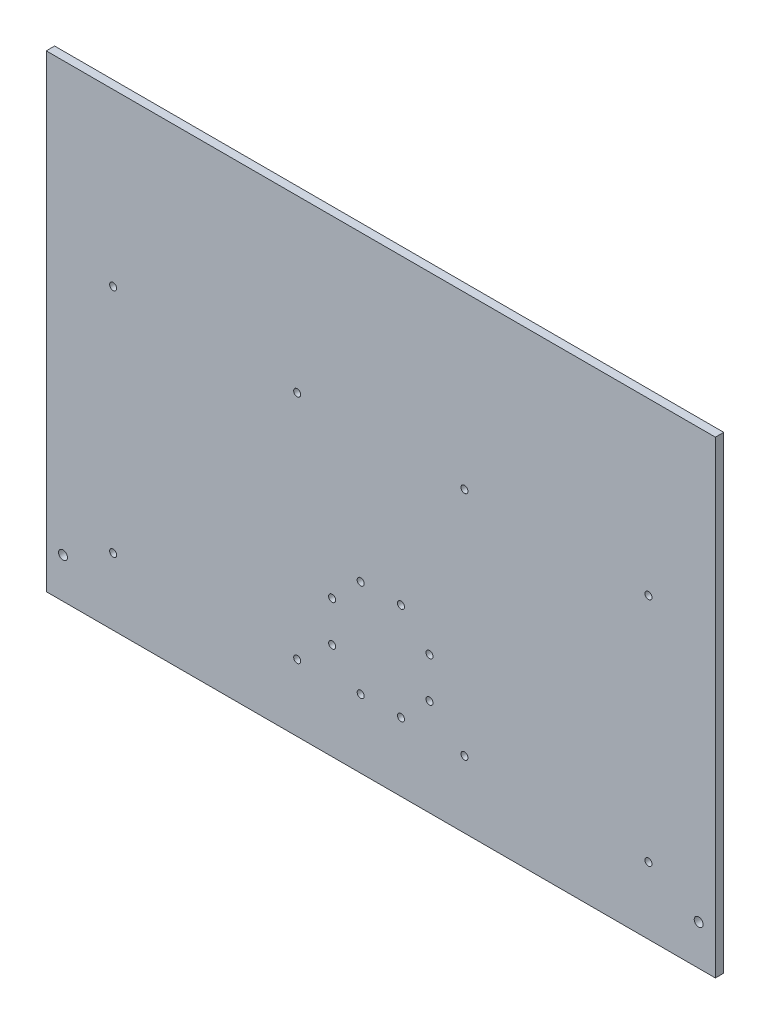
ISO-10303-21;
HEADER;
FILE_DESCRIPTION(('STEP AP214'),'2;1');
FILE_NAME('part.step','',(''),(''),'','','');
FILE_SCHEMA(('AUTOMOTIVE_DESIGN { 1 0 10303 214 1 1 1 1 }'));
ENDSEC;
DATA;
#1=APPLICATION_CONTEXT('core data for automotive mechanical design processes');
#2=APPLICATION_PROTOCOL_DEFINITION('international standard','automotive_design',2000,#1);
#3=PRODUCT_CONTEXT('',#1,'mechanical');
#4=PRODUCT('Part','Part','',(#3));
#5=PRODUCT_RELATED_PRODUCT_CATEGORY('part','',(#4));
#6=PRODUCT_DEFINITION_FORMATION('','',#4);
#7=PRODUCT_DEFINITION_CONTEXT('part definition',#1,'design');
#8=PRODUCT_DEFINITION('design','',#6,#7);
#9=PRODUCT_DEFINITION_SHAPE('','',#8);
#10=(LENGTH_UNIT() NAMED_UNIT(*) SI_UNIT(.MILLI.,.METRE.));
#11=(NAMED_UNIT(*) PLANE_ANGLE_UNIT() SI_UNIT($,.RADIAN.));
#12=(NAMED_UNIT(*) SI_UNIT($,.STERADIAN.) SOLID_ANGLE_UNIT());
#13=UNCERTAINTY_MEASURE_WITH_UNIT(LENGTH_MEASURE(1.E-05),#10,'distance_accuracy_value','');
#14=(GEOMETRIC_REPRESENTATION_CONTEXT(3) GLOBAL_UNCERTAINTY_ASSIGNED_CONTEXT((#13)) GLOBAL_UNIT_ASSIGNED_CONTEXT((#10,
#11,#12)) REPRESENTATION_CONTEXT('',''));
#15=CARTESIAN_POINT('',(0.,0.,0.));
#16=DIRECTION('',(0.,0.,1.));
#17=DIRECTION('',(1.,0.,0.));
#18=AXIS2_PLACEMENT_3D('',#15,#16,#17);
#19=CARTESIAN_POINT('',(200.,140.,5.));
#20=DIRECTION('',(-1.,0.,0.));
#21=DIRECTION('',(0.,-1.,0.));
#22=AXIS2_PLACEMENT_3D('',#19,#20,#21);
#23=PLANE('',#22);
#24=DIRECTION('',(0.,1.,0.));
#25=VECTOR('',#24,1.);
#26=CARTESIAN_POINT('',(200.,140.,0.));
#27=LINE('',#26,#25);
#28=CARTESIAN_POINT('',(200.,-140.,0.));
#29=VERTEX_POINT('',#28);
#30=CARTESIAN_POINT('',(200.,140.,0.));
#31=VERTEX_POINT('',#30);
#32=EDGE_CURVE('E112',#29,#31,#27,.T.);
#33=ORIENTED_EDGE('',*,*,#32,.T.);
#34=DIRECTION('',(0.,0.,-1.));
#35=VECTOR('',#34,1.);
#36=CARTESIAN_POINT('',(200.,140.,5.));
#37=LINE('',#36,#35);
#38=CARTESIAN_POINT('',(200.,140.,5.));
#39=VERTEX_POINT('',#38);
#40=EDGE_CURVE('E11',#39,#31,#37,.T.);
#41=ORIENTED_EDGE('',*,*,#40,.F.);
#42=DIRECTION('',(0.,1.,0.));
#43=VECTOR('',#42,1.);
#44=CARTESIAN_POINT('',(200.,140.,5.));
#45=LINE('',#44,#43);
#46=CARTESIAN_POINT('',(200.,-140.,5.));
#47=VERTEX_POINT('',#46);
#48=EDGE_CURVE('E94',#47,#39,#45,.T.);
#49=ORIENTED_EDGE('',*,*,#48,.F.);
#50=DIRECTION('',(0.,0.,-1.));
#51=VECTOR('',#50,1.);
#52=CARTESIAN_POINT('',(200.,-140.,5.));
#53=LINE('',#52,#51);
#54=EDGE_CURVE('E108',#47,#29,#53,.T.);
#55=ORIENTED_EDGE('',*,*,#54,.T.);
#56=EDGE_LOOP('',(#33,#41,#49,#55));
#57=FACE_BOUND('',#56,.T.);
#58=ADVANCED_FACE('F42',(#57),#23,.F.);
#59=CARTESIAN_POINT('',(-200.,140.,5.));
#60=DIRECTION('',(0.,-1.,0.));
#61=DIRECTION('',(0.,0.,-1.));
#62=AXIS2_PLACEMENT_3D('',#59,#60,#61);
#63=PLANE('',#62);
#64=DIRECTION('',(-1.,0.,0.));
#65=VECTOR('',#64,1.);
#66=CARTESIAN_POINT('',(-200.,140.,0.));
#67=LINE('',#66,#65);
#68=CARTESIAN_POINT('',(-200.,140.,0.));
#69=VERTEX_POINT('',#68);
#70=EDGE_CURVE('E99',#31,#69,#67,.T.);
#71=ORIENTED_EDGE('',*,*,#70,.T.);
#72=DIRECTION('',(0.,0.,-1.));
#73=VECTOR('',#72,1.);
#74=CARTESIAN_POINT('',(-200.,140.,5.));
#75=LINE('',#74,#73);
#76=CARTESIAN_POINT('',(-200.,140.,5.));
#77=VERTEX_POINT('',#76);
#78=EDGE_CURVE('E51',#77,#69,#75,.T.);
#79=ORIENTED_EDGE('',*,*,#78,.F.);
#80=DIRECTION('',(-1.,0.,0.));
#81=VECTOR('',#80,1.);
#82=CARTESIAN_POINT('',(-200.,140.,5.));
#83=LINE('',#82,#81);
#84=EDGE_CURVE('E89',#39,#77,#83,.T.);
#85=ORIENTED_EDGE('',*,*,#84,.F.);
#86=ORIENTED_EDGE('',*,*,#40,.T.);
#87=EDGE_LOOP('',(#71,#79,#85,#86));
#88=FACE_BOUND('',#87,.T.);
#89=ADVANCED_FACE('F98',(#88),#63,.F.);
#90=CARTESIAN_POINT('',(-200.,140.,5.));
#91=DIRECTION('',(1.,0.,0.));
#92=DIRECTION('',(0.,1.,0.));
#93=AXIS2_PLACEMENT_3D('',#90,#91,#92);
#94=PLANE('',#93);
#95=DIRECTION('',(0.,-1.,0.));
#96=VECTOR('',#95,1.);
#97=CARTESIAN_POINT('',(-200.,140.,0.));
#98=LINE('',#97,#96);
#99=CARTESIAN_POINT('',(-200.,-140.,0.));
#100=VERTEX_POINT('',#99);
#101=EDGE_CURVE('E76',#69,#100,#98,.T.);
#102=ORIENTED_EDGE('',*,*,#101,.T.);
#103=DIRECTION('',(0.,0.,-1.));
#104=VECTOR('',#103,1.);
#105=CARTESIAN_POINT('',(-200.,-140.,5.));
#106=LINE('',#105,#104);
#107=CARTESIAN_POINT('',(-200.,-140.,5.));
#108=VERTEX_POINT('',#107);
#109=EDGE_CURVE('E101',#108,#100,#106,.T.);
#110=ORIENTED_EDGE('',*,*,#109,.F.);
#111=DIRECTION('',(0.,-1.,0.));
#112=VECTOR('',#111,1.);
#113=CARTESIAN_POINT('',(-200.,140.,5.));
#114=LINE('',#113,#112);
#115=EDGE_CURVE('E92',#77,#108,#114,.T.);
#116=ORIENTED_EDGE('',*,*,#115,.F.);
#117=ORIENTED_EDGE('',*,*,#78,.T.);
#118=EDGE_LOOP('',(#102,#110,#116,#117));
#119=FACE_BOUND('',#118,.T.);
#120=ADVANCED_FACE('F102',(#119),#94,.F.);
#121=CARTESIAN_POINT('',(-200.,-140.,5.));
#122=DIRECTION('',(0.,1.,0.));
#123=DIRECTION('',(0.,0.,1.));
#124=AXIS2_PLACEMENT_3D('',#121,#122,#123);
#125=PLANE('',#124);
#126=DIRECTION('',(1.,0.,0.));
#127=VECTOR('',#126,1.);
#128=CARTESIAN_POINT('',(-200.,-140.,0.));
#129=LINE('',#128,#127);
#130=EDGE_CURVE('E82',#100,#29,#129,.T.);
#131=ORIENTED_EDGE('',*,*,#130,.T.);
#132=ORIENTED_EDGE('',*,*,#54,.F.);
#133=DIRECTION('',(1.,0.,0.));
#134=VECTOR('',#133,1.);
#135=CARTESIAN_POINT('',(-200.,-140.,5.));
#136=LINE('',#135,#134);
#137=EDGE_CURVE('E59',#108,#47,#136,.T.);
#138=ORIENTED_EDGE('',*,*,#137,.F.);
#139=ORIENTED_EDGE('',*,*,#109,.T.);
#140=EDGE_LOOP('',(#131,#132,#138,#139));
#141=FACE_BOUND('',#140,.T.);
#142=ADVANCED_FACE('F128',(#141),#125,.F.);
#143=CARTESIAN_POINT('',(0.,0.,5.));
#144=DIRECTION('',(0.,0.,1.));
#145=DIRECTION('',(1.,0.,0.));
#146=AXIS2_PLACEMENT_3D('',#143,#144,#145);
#147=PLANE('',#146);
#148=CARTESIAN_POINT('',(-160.,38.,5.));
#149=DIRECTION('',(0.,0.,1.));
#150=DIRECTION('',(1.,0.,0.));
#151=AXIS2_PLACEMENT_3D('',#148,#149,#150);
#152=CIRCLE('',#151,2.09999999999999);
#153=CARTESIAN_POINT('',(-157.9,38.,5.));
#154=VERTEX_POINT('',#153);
#155=EDGE_CURVE('E276',#154,#154,#152,.T.);
#156=ORIENTED_EDGE('',*,*,#155,.F.);
#157=EDGE_LOOP('',(#156));
#158=FACE_BOUND('',#157,.T.);
#159=CARTESIAN_POINT('',(-50.,38.,5.));
#160=DIRECTION('',(0.,0.,1.));
#161=DIRECTION('',(1.,0.,0.));
#162=AXIS2_PLACEMENT_3D('',#159,#160,#161);
#163=CIRCLE('',#162,2.1);
#164=CARTESIAN_POINT('',(-47.9,38.,5.));
#165=VERTEX_POINT('',#164);
#166=EDGE_CURVE('E268',#165,#165,#163,.T.);
#167=ORIENTED_EDGE('',*,*,#166,.F.);
#168=EDGE_LOOP('',(#167));
#169=FACE_BOUND('',#168,.T.);
#170=CARTESIAN_POINT('',(50.,38.,5.));
#171=DIRECTION('',(0.,0.,1.));
#172=DIRECTION('',(1.,0.,0.));
#173=AXIS2_PLACEMENT_3D('',#170,#171,#172);
#174=CIRCLE('',#173,2.1);
#175=CARTESIAN_POINT('',(52.1,38.,5.));
#176=VERTEX_POINT('',#175);
#177=EDGE_CURVE('E260',#176,#176,#174,.T.);
#178=ORIENTED_EDGE('',*,*,#177,.F.);
#179=EDGE_LOOP('',(#178));
#180=FACE_BOUND('',#179,.T.);
#181=CARTESIAN_POINT('',(160.,38.,5.));
#182=DIRECTION('',(0.,0.,1.));
#183=DIRECTION('',(1.,0.,0.));
#184=AXIS2_PLACEMENT_3D('',#181,#182,#183);
#185=CIRCLE('',#184,2.09999999999999);
#186=CARTESIAN_POINT('',(162.1,38.,5.));
#187=VERTEX_POINT('',#186);
#188=EDGE_CURVE('E252',#187,#187,#185,.T.);
#189=ORIENTED_EDGE('',*,*,#188,.F.);
#190=EDGE_LOOP('',(#189));
#191=FACE_BOUND('',#190,.T.);
#192=CARTESIAN_POINT('',(160.,-100.,5.));
#193=DIRECTION('',(0.,0.,1.));
#194=DIRECTION('',(1.,0.,0.));
#195=AXIS2_PLACEMENT_3D('',#192,#193,#194);
#196=CIRCLE('',#195,2.09999999999999);
#197=CARTESIAN_POINT('',(162.1,-100.,5.));
#198=VERTEX_POINT('',#197);
#199=EDGE_CURVE('E244',#198,#198,#196,.T.);
#200=ORIENTED_EDGE('',*,*,#199,.F.);
#201=EDGE_LOOP('',(#200));
#202=FACE_BOUND('',#201,.T.);
#203=CARTESIAN_POINT('',(50.,-100.,5.));
#204=DIRECTION('',(0.,0.,1.));
#205=DIRECTION('',(1.,0.,0.));
#206=AXIS2_PLACEMENT_3D('',#203,#204,#205);
#207=CIRCLE('',#206,2.1);
#208=CARTESIAN_POINT('',(52.1,-100.,5.));
#209=VERTEX_POINT('',#208);
#210=EDGE_CURVE('E236',#209,#209,#207,.T.);
#211=ORIENTED_EDGE('',*,*,#210,.F.);
#212=EDGE_LOOP('',(#211));
#213=FACE_BOUND('',#212,.T.);
#214=CARTESIAN_POINT('',(-50.,-100.,5.));
#215=DIRECTION('',(0.,0.,1.));
#216=DIRECTION('',(1.,0.,0.));
#217=AXIS2_PLACEMENT_3D('',#214,#215,#216);
#218=CIRCLE('',#217,2.1);
#219=CARTESIAN_POINT('',(-47.9,-100.,5.));
#220=VERTEX_POINT('',#219);
#221=EDGE_CURVE('E228',#220,#220,#218,.T.);
#222=ORIENTED_EDGE('',*,*,#221,.F.);
#223=EDGE_LOOP('',(#222));
#224=FACE_BOUND('',#223,.T.);
#225=CARTESIAN_POINT('',(-160.,-100.,5.));
#226=DIRECTION('',(0.,0.,1.));
#227=DIRECTION('',(1.,0.,0.));
#228=AXIS2_PLACEMENT_3D('',#225,#226,#227);
#229=CIRCLE('',#228,2.09999999999999);
#230=CARTESIAN_POINT('',(-157.9,-100.,5.));
#231=VERTEX_POINT('',#230);
#232=EDGE_CURVE('E220',#231,#231,#229,.T.);
#233=ORIENTED_EDGE('',*,*,#232,.F.);
#234=EDGE_LOOP('',(#233));
#235=FACE_BOUND('',#234,.T.);
#236=CARTESIAN_POINT('',(-190.,-116.,5.));
#237=DIRECTION('',(0.,0.,1.));
#238=DIRECTION('',(1.,0.,0.));
#239=AXIS2_PLACEMENT_3D('',#236,#237,#238);
#240=CIRCLE('',#239,2.65000000000001);
#241=CARTESIAN_POINT('',(-187.35,-116.,5.));
#242=VERTEX_POINT('',#241);
#243=EDGE_CURVE('E212',#242,#242,#240,.T.);
#244=ORIENTED_EDGE('',*,*,#243,.F.);
#245=EDGE_LOOP('',(#244));
#246=FACE_BOUND('',#245,.T.);
#247=CARTESIAN_POINT('',(190.,-116.,5.));
#248=DIRECTION('',(0.,0.,1.));
#249=DIRECTION('',(1.,0.,0.));
#250=AXIS2_PLACEMENT_3D('',#247,#248,#249);
#251=CIRCLE('',#250,2.64999999999999);
#252=CARTESIAN_POINT('',(192.65,-116.,5.));
#253=VERTEX_POINT('',#252);
#254=EDGE_CURVE('E204',#253,#253,#251,.T.);
#255=ORIENTED_EDGE('',*,*,#254,.F.);
#256=EDGE_LOOP('',(#255));
#257=FACE_BOUND('',#256,.T.);
#258=CARTESIAN_POINT('',(12.0545281195004,-40.8977947258942,5.));
#259=DIRECTION('',(0.,0.,1.));
#260=DIRECTION('',(1.,0.,0.));
#261=AXIS2_PLACEMENT_3D('',#258,#259,#260);
#262=CIRCLE('',#261,2.1);
#263=CARTESIAN_POINT('',(14.1545281195004,-40.8977947258942,5.));
#264=VERTEX_POINT('',#263);
#265=EDGE_CURVE('E196',#264,#264,#262,.T.);
#266=ORIENTED_EDGE('',*,*,#265,.F.);
#267=EDGE_LOOP('',(#266));
#268=FACE_BOUND('',#267,.T.);
#269=CARTESIAN_POINT('',(29.1022052741061,-57.945471880499,5.));
#270=DIRECTION('',(0.,0.,1.));
#271=DIRECTION('',(1.,0.,0.));
#272=AXIS2_PLACEMENT_3D('',#269,#270,#271);
#273=CIRCLE('',#272,2.1);
#274=CARTESIAN_POINT('',(31.2022052741061,-57.945471880499,5.));
#275=VERTEX_POINT('',#274);
#276=EDGE_CURVE('E188',#275,#275,#273,.T.);
#277=ORIENTED_EDGE('',*,*,#276,.F.);
#278=EDGE_LOOP('',(#277));
#279=FACE_BOUND('',#278,.T.);
#280=CARTESIAN_POINT('',(29.1022052741067,-82.0545281194997,5.));
#281=DIRECTION('',(0.,0.,1.));
#282=DIRECTION('',(1.,0.,0.));
#283=AXIS2_PLACEMENT_3D('',#280,#281,#282);
#284=CIRCLE('',#283,2.1);
#285=CARTESIAN_POINT('',(31.2022052741067,-82.0545281194997,5.));
#286=VERTEX_POINT('',#285);
#287=EDGE_CURVE('E180',#286,#286,#284,.T.);
#288=ORIENTED_EDGE('',*,*,#287,.F.);
#289=EDGE_LOOP('',(#288));
#290=FACE_BOUND('',#289,.T.);
#291=CARTESIAN_POINT('',(12.0545281195018,-99.1022052741053,5.));
#292=DIRECTION('',(0.,0.,1.));
#293=DIRECTION('',(1.,0.,0.));
#294=AXIS2_PLACEMENT_3D('',#291,#292,#293);
#295=CIRCLE('',#294,2.1);
#296=CARTESIAN_POINT('',(14.1545281195018,-99.1022052741053,5.));
#297=VERTEX_POINT('',#296);
#298=EDGE_CURVE('E172',#297,#297,#295,.T.);
#299=ORIENTED_EDGE('',*,*,#298,.F.);
#300=EDGE_LOOP('',(#299));
#301=FACE_BOUND('',#300,.T.);
#302=CARTESIAN_POINT('',(-12.0545281194989,-99.1022052741057,5.));
#303=DIRECTION('',(0.,0.,1.));
#304=DIRECTION('',(1.,0.,0.));
#305=AXIS2_PLACEMENT_3D('',#302,#303,#304);
#306=CIRCLE('',#305,2.1);
#307=CARTESIAN_POINT('',(-9.95452811949888,-99.1022052741057,5.));
#308=VERTEX_POINT('',#307);
#309=EDGE_CURVE('E164',#308,#308,#306,.T.);
#310=ORIENTED_EDGE('',*,*,#309,.F.);
#311=EDGE_LOOP('',(#310));
#312=FACE_BOUND('',#311,.T.);
#313=CARTESIAN_POINT('',(-29.1022052741044,-82.0545281195008,5.));
#314=DIRECTION('',(0.,0.,1.));
#315=DIRECTION('',(1.,0.,0.));
#316=AXIS2_PLACEMENT_3D('',#313,#314,#315);
#317=CIRCLE('',#316,2.1);
#318=CARTESIAN_POINT('',(-27.0022052741044,-82.0545281195008,5.));
#319=VERTEX_POINT('',#318);
#320=EDGE_CURVE('E156',#319,#319,#317,.T.);
#321=ORIENTED_EDGE('',*,*,#320,.F.);
#322=EDGE_LOOP('',(#321));
#323=FACE_BOUND('',#322,.T.);
#324=CARTESIAN_POINT('',(-29.1022052741048,-57.9454718805002,5.));
#325=DIRECTION('',(0.,0.,1.));
#326=DIRECTION('',(1.,0.,0.));
#327=AXIS2_PLACEMENT_3D('',#324,#325,#326);
#328=CIRCLE('',#327,2.1);
#329=CARTESIAN_POINT('',(-27.0022052741048,-57.9454718805002,5.));
#330=VERTEX_POINT('',#329);
#331=EDGE_CURVE('E148',#330,#330,#328,.T.);
#332=ORIENTED_EDGE('',*,*,#331,.F.);
#333=EDGE_LOOP('',(#332));
#334=FACE_BOUND('',#333,.T.);
#335=CARTESIAN_POINT('',(-12.0545281194998,-40.8977947258946,5.));
#336=DIRECTION('',(0.,0.,1.));
#337=DIRECTION('',(1.,0.,0.));
#338=AXIS2_PLACEMENT_3D('',#335,#336,#337);
#339=CIRCLE('',#338,2.1);
#340=CARTESIAN_POINT('',(-9.95452811949984,-40.8977947258946,5.));
#341=VERTEX_POINT('',#340);
#342=EDGE_CURVE('E140',#341,#341,#339,.T.);
#343=ORIENTED_EDGE('',*,*,#342,.F.);
#344=EDGE_LOOP('',(#343));
#345=FACE_BOUND('',#344,.T.);
#346=ORIENTED_EDGE('',*,*,#48,.T.);
#347=ORIENTED_EDGE('',*,*,#84,.T.);
#348=ORIENTED_EDGE('',*,*,#115,.T.);
#349=ORIENTED_EDGE('',*,*,#137,.T.);
#350=EDGE_LOOP('',(#346,#347,#348,#349));
#351=FACE_BOUND('',#350,.T.);
#352=ADVANCED_FACE('F90',(#158,#169,#180,#191,#202,#213,#224,#235,#246,#257,#268,#279,#290,#301,
#312,#323,#334,#345,#351),#147,.T.);
#353=CARTESIAN_POINT('',(0.,0.,0.));
#354=DIRECTION('',(0.,0.,1.));
#355=DIRECTION('',(1.,0.,0.));
#356=AXIS2_PLACEMENT_3D('',#353,#354,#355);
#357=PLANE('',#356);
#358=CARTESIAN_POINT('',(-160.,38.,0.));
#359=DIRECTION('',(0.,0.,1.));
#360=DIRECTION('',(1.,0.,0.));
#361=AXIS2_PLACEMENT_3D('',#358,#359,#360);
#362=CIRCLE('',#361,2.09999999999999);
#363=CARTESIAN_POINT('',(-157.9,38.,0.));
#364=VERTEX_POINT('',#363);
#365=EDGE_CURVE('E272',#364,#364,#362,.T.);
#366=ORIENTED_EDGE('',*,*,#365,.T.);
#367=EDGE_LOOP('',(#366));
#368=FACE_BOUND('',#367,.T.);
#369=CARTESIAN_POINT('',(-50.,38.,0.));
#370=DIRECTION('',(0.,0.,1.));
#371=DIRECTION('',(1.,0.,0.));
#372=AXIS2_PLACEMENT_3D('',#369,#370,#371);
#373=CIRCLE('',#372,2.1);
#374=CARTESIAN_POINT('',(-47.9,38.,0.));
#375=VERTEX_POINT('',#374);
#376=EDGE_CURVE('E264',#375,#375,#373,.T.);
#377=ORIENTED_EDGE('',*,*,#376,.T.);
#378=EDGE_LOOP('',(#377));
#379=FACE_BOUND('',#378,.T.);
#380=CARTESIAN_POINT('',(50.,38.,0.));
#381=DIRECTION('',(0.,0.,1.));
#382=DIRECTION('',(1.,0.,0.));
#383=AXIS2_PLACEMENT_3D('',#380,#381,#382);
#384=CIRCLE('',#383,2.1);
#385=CARTESIAN_POINT('',(52.1,38.,0.));
#386=VERTEX_POINT('',#385);
#387=EDGE_CURVE('E256',#386,#386,#384,.T.);
#388=ORIENTED_EDGE('',*,*,#387,.T.);
#389=EDGE_LOOP('',(#388));
#390=FACE_BOUND('',#389,.T.);
#391=CARTESIAN_POINT('',(160.,38.,0.));
#392=DIRECTION('',(0.,0.,1.));
#393=DIRECTION('',(1.,0.,0.));
#394=AXIS2_PLACEMENT_3D('',#391,#392,#393);
#395=CIRCLE('',#394,2.09999999999999);
#396=CARTESIAN_POINT('',(162.1,38.,0.));
#397=VERTEX_POINT('',#396);
#398=EDGE_CURVE('E248',#397,#397,#395,.T.);
#399=ORIENTED_EDGE('',*,*,#398,.T.);
#400=EDGE_LOOP('',(#399));
#401=FACE_BOUND('',#400,.T.);
#402=CARTESIAN_POINT('',(160.,-100.,0.));
#403=DIRECTION('',(0.,0.,1.));
#404=DIRECTION('',(1.,0.,0.));
#405=AXIS2_PLACEMENT_3D('',#402,#403,#404);
#406=CIRCLE('',#405,2.09999999999999);
#407=CARTESIAN_POINT('',(162.1,-100.,0.));
#408=VERTEX_POINT('',#407);
#409=EDGE_CURVE('E240',#408,#408,#406,.T.);
#410=ORIENTED_EDGE('',*,*,#409,.T.);
#411=EDGE_LOOP('',(#410));
#412=FACE_BOUND('',#411,.T.);
#413=CARTESIAN_POINT('',(50.,-100.,0.));
#414=DIRECTION('',(0.,0.,1.));
#415=DIRECTION('',(1.,0.,0.));
#416=AXIS2_PLACEMENT_3D('',#413,#414,#415);
#417=CIRCLE('',#416,2.1);
#418=CARTESIAN_POINT('',(52.1,-100.,0.));
#419=VERTEX_POINT('',#418);
#420=EDGE_CURVE('E232',#419,#419,#417,.T.);
#421=ORIENTED_EDGE('',*,*,#420,.T.);
#422=EDGE_LOOP('',(#421));
#423=FACE_BOUND('',#422,.T.);
#424=CARTESIAN_POINT('',(-50.,-100.,0.));
#425=DIRECTION('',(0.,0.,1.));
#426=DIRECTION('',(1.,0.,0.));
#427=AXIS2_PLACEMENT_3D('',#424,#425,#426);
#428=CIRCLE('',#427,2.1);
#429=CARTESIAN_POINT('',(-47.9,-100.,0.));
#430=VERTEX_POINT('',#429);
#431=EDGE_CURVE('E224',#430,#430,#428,.T.);
#432=ORIENTED_EDGE('',*,*,#431,.T.);
#433=EDGE_LOOP('',(#432));
#434=FACE_BOUND('',#433,.T.);
#435=CARTESIAN_POINT('',(-160.,-100.,0.));
#436=DIRECTION('',(0.,0.,1.));
#437=DIRECTION('',(1.,0.,0.));
#438=AXIS2_PLACEMENT_3D('',#435,#436,#437);
#439=CIRCLE('',#438,2.09999999999999);
#440=CARTESIAN_POINT('',(-157.9,-100.,0.));
#441=VERTEX_POINT('',#440);
#442=EDGE_CURVE('E216',#441,#441,#439,.T.);
#443=ORIENTED_EDGE('',*,*,#442,.T.);
#444=EDGE_LOOP('',(#443));
#445=FACE_BOUND('',#444,.T.);
#446=CARTESIAN_POINT('',(-190.,-116.,0.));
#447=DIRECTION('',(0.,0.,1.));
#448=DIRECTION('',(1.,0.,0.));
#449=AXIS2_PLACEMENT_3D('',#446,#447,#448);
#450=CIRCLE('',#449,2.64999999999999);
#451=CARTESIAN_POINT('',(-187.35,-116.,0.));
#452=VERTEX_POINT('',#451);
#453=EDGE_CURVE('E208',#452,#452,#450,.T.);
#454=ORIENTED_EDGE('',*,*,#453,.T.);
#455=EDGE_LOOP('',(#454));
#456=FACE_BOUND('',#455,.T.);
#457=CARTESIAN_POINT('',(190.,-116.,0.));
#458=DIRECTION('',(0.,0.,1.));
#459=DIRECTION('',(1.,0.,0.));
#460=AXIS2_PLACEMENT_3D('',#457,#458,#459);
#461=CIRCLE('',#460,2.64999999999999);
#462=CARTESIAN_POINT('',(192.65,-116.,0.));
#463=VERTEX_POINT('',#462);
#464=EDGE_CURVE('E200',#463,#463,#461,.T.);
#465=ORIENTED_EDGE('',*,*,#464,.T.);
#466=EDGE_LOOP('',(#465));
#467=FACE_BOUND('',#466,.T.);
#468=CARTESIAN_POINT('',(12.0545281195004,-40.8977947258942,0.));
#469=DIRECTION('',(0.,0.,1.));
#470=DIRECTION('',(1.,0.,0.));
#471=AXIS2_PLACEMENT_3D('',#468,#469,#470);
#472=CIRCLE('',#471,2.1);
#473=CARTESIAN_POINT('',(14.1545281195004,-40.8977947258942,0.));
#474=VERTEX_POINT('',#473);
#475=EDGE_CURVE('E192',#474,#474,#472,.T.);
#476=ORIENTED_EDGE('',*,*,#475,.T.);
#477=EDGE_LOOP('',(#476));
#478=FACE_BOUND('',#477,.T.);
#479=CARTESIAN_POINT('',(29.1022052741061,-57.945471880499,0.));
#480=DIRECTION('',(0.,0.,1.));
#481=DIRECTION('',(1.,0.,0.));
#482=AXIS2_PLACEMENT_3D('',#479,#480,#481);
#483=CIRCLE('',#482,2.1);
#484=CARTESIAN_POINT('',(31.2022052741061,-57.945471880499,0.));
#485=VERTEX_POINT('',#484);
#486=EDGE_CURVE('E184',#485,#485,#483,.T.);
#487=ORIENTED_EDGE('',*,*,#486,.T.);
#488=EDGE_LOOP('',(#487));
#489=FACE_BOUND('',#488,.T.);
#490=CARTESIAN_POINT('',(29.1022052741067,-82.0545281194997,0.));
#491=DIRECTION('',(0.,0.,1.));
#492=DIRECTION('',(1.,0.,0.));
#493=AXIS2_PLACEMENT_3D('',#490,#491,#492);
#494=CIRCLE('',#493,2.1);
#495=CARTESIAN_POINT('',(31.2022052741067,-82.0545281194997,0.));
#496=VERTEX_POINT('',#495);
#497=EDGE_CURVE('E176',#496,#496,#494,.T.);
#498=ORIENTED_EDGE('',*,*,#497,.T.);
#499=EDGE_LOOP('',(#498));
#500=FACE_BOUND('',#499,.T.);
#501=CARTESIAN_POINT('',(12.0545281195018,-99.1022052741053,0.));
#502=DIRECTION('',(0.,0.,1.));
#503=DIRECTION('',(1.,0.,0.));
#504=AXIS2_PLACEMENT_3D('',#501,#502,#503);
#505=CIRCLE('',#504,2.1);
#506=CARTESIAN_POINT('',(14.1545281195018,-99.1022052741053,0.));
#507=VERTEX_POINT('',#506);
#508=EDGE_CURVE('E168',#507,#507,#505,.T.);
#509=ORIENTED_EDGE('',*,*,#508,.T.);
#510=EDGE_LOOP('',(#509));
#511=FACE_BOUND('',#510,.T.);
#512=CARTESIAN_POINT('',(-12.0545281194989,-99.1022052741057,0.));
#513=DIRECTION('',(0.,0.,1.));
#514=DIRECTION('',(1.,0.,0.));
#515=AXIS2_PLACEMENT_3D('',#512,#513,#514);
#516=CIRCLE('',#515,2.1);
#517=CARTESIAN_POINT('',(-9.95452811949888,-99.1022052741057,0.));
#518=VERTEX_POINT('',#517);
#519=EDGE_CURVE('E160',#518,#518,#516,.T.);
#520=ORIENTED_EDGE('',*,*,#519,.T.);
#521=EDGE_LOOP('',(#520));
#522=FACE_BOUND('',#521,.T.);
#523=CARTESIAN_POINT('',(-29.1022052741044,-82.0545281195008,0.));
#524=DIRECTION('',(0.,0.,1.));
#525=DIRECTION('',(1.,0.,0.));
#526=AXIS2_PLACEMENT_3D('',#523,#524,#525);
#527=CIRCLE('',#526,2.1);
#528=CARTESIAN_POINT('',(-27.0022052741044,-82.0545281195008,0.));
#529=VERTEX_POINT('',#528);
#530=EDGE_CURVE('E152',#529,#529,#527,.T.);
#531=ORIENTED_EDGE('',*,*,#530,.T.);
#532=EDGE_LOOP('',(#531));
#533=FACE_BOUND('',#532,.T.);
#534=CARTESIAN_POINT('',(-29.1022052741048,-57.9454718805002,0.));
#535=DIRECTION('',(0.,0.,1.));
#536=DIRECTION('',(1.,0.,0.));
#537=AXIS2_PLACEMENT_3D('',#534,#535,#536);
#538=CIRCLE('',#537,2.1);
#539=CARTESIAN_POINT('',(-27.0022052741048,-57.9454718805002,0.));
#540=VERTEX_POINT('',#539);
#541=EDGE_CURVE('E144',#540,#540,#538,.T.);
#542=ORIENTED_EDGE('',*,*,#541,.T.);
#543=EDGE_LOOP('',(#542));
#544=FACE_BOUND('',#543,.T.);
#545=CARTESIAN_POINT('',(-12.0545281194998,-40.8977947258946,0.));
#546=DIRECTION('',(0.,0.,1.));
#547=DIRECTION('',(1.,0.,0.));
#548=AXIS2_PLACEMENT_3D('',#545,#546,#547);
#549=CIRCLE('',#548,2.1);
#550=CARTESIAN_POINT('',(-9.95452811949984,-40.8977947258946,0.));
#551=VERTEX_POINT('',#550);
#552=EDGE_CURVE('E116',#551,#551,#549,.T.);
#553=ORIENTED_EDGE('',*,*,#552,.T.);
#554=EDGE_LOOP('',(#553));
#555=FACE_BOUND('',#554,.T.);
#556=ORIENTED_EDGE('',*,*,#32,.F.);
#557=ORIENTED_EDGE('',*,*,#130,.F.);
#558=ORIENTED_EDGE('',*,*,#101,.F.);
#559=ORIENTED_EDGE('',*,*,#70,.F.);
#560=EDGE_LOOP('',(#556,#557,#558,#559));
#561=FACE_BOUND('',#560,.T.);
#562=ADVANCED_FACE('F131',(#368,#379,#390,#401,#412,#423,#434,#445,#456,#467,#478,#489,#500,
#511,#522,#533,#544,#555,#561),#357,.F.);
#563=CARTESIAN_POINT('',(-12.0545281194998,-40.8977947258946,5.));
#564=DIRECTION('',(0.,0.,1.));
#565=DIRECTION('',(1.,0.,0.));
#566=AXIS2_PLACEMENT_3D('',#563,#564,#565);
#567=CYLINDRICAL_SURFACE('',#566,2.1);
#568=ORIENTED_EDGE('',*,*,#552,.F.);
#569=EDGE_LOOP('',(#568));
#570=FACE_BOUND('',#569,.T.);
#571=ORIENTED_EDGE('',*,*,#342,.T.);
#572=EDGE_LOOP('',(#571));
#573=FACE_BOUND('',#572,.T.);
#574=ADVANCED_FACE('F322',(#570,#573),#567,.F.);
#575=CARTESIAN_POINT('',(-29.1022052741048,-57.9454718805002,5.));
#576=DIRECTION('',(0.,0.,1.));
#577=DIRECTION('',(1.,0.,0.));
#578=AXIS2_PLACEMENT_3D('',#575,#576,#577);
#579=CYLINDRICAL_SURFACE('',#578,2.1);
#580=ORIENTED_EDGE('',*,*,#541,.F.);
#581=EDGE_LOOP('',(#580));
#582=FACE_BOUND('',#581,.T.);
#583=ORIENTED_EDGE('',*,*,#331,.T.);
#584=EDGE_LOOP('',(#583));
#585=FACE_BOUND('',#584,.T.);
#586=ADVANCED_FACE('F324',(#582,#585),#579,.F.);
#587=CARTESIAN_POINT('',(-29.1022052741044,-82.0545281195008,5.));
#588=DIRECTION('',(0.,0.,1.));
#589=DIRECTION('',(1.,0.,0.));
#590=AXIS2_PLACEMENT_3D('',#587,#588,#589);
#591=CYLINDRICAL_SURFACE('',#590,2.1);
#592=ORIENTED_EDGE('',*,*,#530,.F.);
#593=EDGE_LOOP('',(#592));
#594=FACE_BOUND('',#593,.T.);
#595=ORIENTED_EDGE('',*,*,#320,.T.);
#596=EDGE_LOOP('',(#595));
#597=FACE_BOUND('',#596,.T.);
#598=ADVANCED_FACE('F331',(#594,#597),#591,.F.);
#599=CARTESIAN_POINT('',(-12.0545281194989,-99.1022052741057,5.));
#600=DIRECTION('',(0.,0.,1.));
#601=DIRECTION('',(1.,0.,0.));
#602=AXIS2_PLACEMENT_3D('',#599,#600,#601);
#603=CYLINDRICAL_SURFACE('',#602,2.1);
#604=ORIENTED_EDGE('',*,*,#519,.F.);
#605=EDGE_LOOP('',(#604));
#606=FACE_BOUND('',#605,.T.);
#607=ORIENTED_EDGE('',*,*,#309,.T.);
#608=EDGE_LOOP('',(#607));
#609=FACE_BOUND('',#608,.T.);
#610=ADVANCED_FACE('F379',(#606,#609),#603,.F.);
#611=CARTESIAN_POINT('',(12.0545281195018,-99.1022052741053,5.));
#612=DIRECTION('',(0.,0.,1.));
#613=DIRECTION('',(1.,0.,0.));
#614=AXIS2_PLACEMENT_3D('',#611,#612,#613);
#615=CYLINDRICAL_SURFACE('',#614,2.1);
#616=ORIENTED_EDGE('',*,*,#508,.F.);
#617=EDGE_LOOP('',(#616));
#618=FACE_BOUND('',#617,.T.);
#619=ORIENTED_EDGE('',*,*,#298,.T.);
#620=EDGE_LOOP('',(#619));
#621=FACE_BOUND('',#620,.T.);
#622=ADVANCED_FACE('F389',(#618,#621),#615,.F.);
#623=CARTESIAN_POINT('',(29.1022052741067,-82.0545281194997,5.));
#624=DIRECTION('',(0.,0.,1.));
#625=DIRECTION('',(1.,0.,0.));
#626=AXIS2_PLACEMENT_3D('',#623,#624,#625);
#627=CYLINDRICAL_SURFACE('',#626,2.1);
#628=ORIENTED_EDGE('',*,*,#497,.F.);
#629=EDGE_LOOP('',(#628));
#630=FACE_BOUND('',#629,.T.);
#631=ORIENTED_EDGE('',*,*,#287,.T.);
#632=EDGE_LOOP('',(#631));
#633=FACE_BOUND('',#632,.T.);
#634=ADVANCED_FACE('F399',(#630,#633),#627,.F.);
#635=CARTESIAN_POINT('',(29.1022052741061,-57.945471880499,5.));
#636=DIRECTION('',(0.,0.,1.));
#637=DIRECTION('',(1.,0.,0.));
#638=AXIS2_PLACEMENT_3D('',#635,#636,#637);
#639=CYLINDRICAL_SURFACE('',#638,2.1);
#640=ORIENTED_EDGE('',*,*,#486,.F.);
#641=EDGE_LOOP('',(#640));
#642=FACE_BOUND('',#641,.T.);
#643=ORIENTED_EDGE('',*,*,#276,.T.);
#644=EDGE_LOOP('',(#643));
#645=FACE_BOUND('',#644,.T.);
#646=ADVANCED_FACE('F409',(#642,#645),#639,.F.);
#647=CARTESIAN_POINT('',(12.0545281195004,-40.8977947258942,5.));
#648=DIRECTION('',(0.,0.,1.));
#649=DIRECTION('',(1.,0.,0.));
#650=AXIS2_PLACEMENT_3D('',#647,#648,#649);
#651=CYLINDRICAL_SURFACE('',#650,2.1);
#652=ORIENTED_EDGE('',*,*,#475,.F.);
#653=EDGE_LOOP('',(#652));
#654=FACE_BOUND('',#653,.T.);
#655=ORIENTED_EDGE('',*,*,#265,.T.);
#656=EDGE_LOOP('',(#655));
#657=FACE_BOUND('',#656,.T.);
#658=ADVANCED_FACE('F419',(#654,#657),#651,.F.);
#659=CARTESIAN_POINT('',(190.,-116.,5.));
#660=DIRECTION('',(0.,0.,1.));
#661=DIRECTION('',(1.,0.,0.));
#662=AXIS2_PLACEMENT_3D('',#659,#660,#661);
#663=CYLINDRICAL_SURFACE('',#662,2.64999999999999);
#664=ORIENTED_EDGE('',*,*,#464,.F.);
#665=EDGE_LOOP('',(#664));
#666=FACE_BOUND('',#665,.T.);
#667=ORIENTED_EDGE('',*,*,#254,.T.);
#668=EDGE_LOOP('',(#667));
#669=FACE_BOUND('',#668,.T.);
#670=ADVANCED_FACE('F429',(#666,#669),#663,.F.);
#671=CARTESIAN_POINT('',(-190.,-116.,5.));
#672=DIRECTION('',(0.,0.,1.));
#673=DIRECTION('',(1.,0.,0.));
#674=AXIS2_PLACEMENT_3D('',#671,#672,#673);
#675=CYLINDRICAL_SURFACE('',#674,2.65);
#676=ORIENTED_EDGE('',*,*,#453,.F.);
#677=EDGE_LOOP('',(#676));
#678=FACE_BOUND('',#677,.T.);
#679=ORIENTED_EDGE('',*,*,#243,.T.);
#680=EDGE_LOOP('',(#679));
#681=FACE_BOUND('',#680,.T.);
#682=ADVANCED_FACE('F439',(#678,#681),#675,.F.);
#683=CARTESIAN_POINT('',(-160.,-100.,5.));
#684=DIRECTION('',(0.,0.,1.));
#685=DIRECTION('',(1.,0.,0.));
#686=AXIS2_PLACEMENT_3D('',#683,#684,#685);
#687=CYLINDRICAL_SURFACE('',#686,2.09999999999999);
#688=ORIENTED_EDGE('',*,*,#442,.F.);
#689=EDGE_LOOP('',(#688));
#690=FACE_BOUND('',#689,.T.);
#691=ORIENTED_EDGE('',*,*,#232,.T.);
#692=EDGE_LOOP('',(#691));
#693=FACE_BOUND('',#692,.T.);
#694=ADVANCED_FACE('F449',(#690,#693),#687,.F.);
#695=CARTESIAN_POINT('',(-50.,-100.,5.));
#696=DIRECTION('',(0.,0.,1.));
#697=DIRECTION('',(1.,0.,0.));
#698=AXIS2_PLACEMENT_3D('',#695,#696,#697);
#699=CYLINDRICAL_SURFACE('',#698,2.1);
#700=ORIENTED_EDGE('',*,*,#431,.F.);
#701=EDGE_LOOP('',(#700));
#702=FACE_BOUND('',#701,.T.);
#703=ORIENTED_EDGE('',*,*,#221,.T.);
#704=EDGE_LOOP('',(#703));
#705=FACE_BOUND('',#704,.T.);
#706=ADVANCED_FACE('F458',(#702,#705),#699,.F.);
#707=CARTESIAN_POINT('',(50.,-100.,5.));
#708=DIRECTION('',(0.,0.,1.));
#709=DIRECTION('',(1.,0.,0.));
#710=AXIS2_PLACEMENT_3D('',#707,#708,#709);
#711=CYLINDRICAL_SURFACE('',#710,2.1);
#712=ORIENTED_EDGE('',*,*,#420,.F.);
#713=EDGE_LOOP('',(#712));
#714=FACE_BOUND('',#713,.T.);
#715=ORIENTED_EDGE('',*,*,#210,.T.);
#716=EDGE_LOOP('',(#715));
#717=FACE_BOUND('',#716,.T.);
#718=ADVANCED_FACE('F468',(#714,#717),#711,.F.);
#719=CARTESIAN_POINT('',(160.,-100.,5.));
#720=DIRECTION('',(0.,0.,1.));
#721=DIRECTION('',(1.,0.,0.));
#722=AXIS2_PLACEMENT_3D('',#719,#720,#721);
#723=CYLINDRICAL_SURFACE('',#722,2.09999999999999);
#724=ORIENTED_EDGE('',*,*,#409,.F.);
#725=EDGE_LOOP('',(#724));
#726=FACE_BOUND('',#725,.T.);
#727=ORIENTED_EDGE('',*,*,#199,.T.);
#728=EDGE_LOOP('',(#727));
#729=FACE_BOUND('',#728,.T.);
#730=ADVANCED_FACE('F478',(#726,#729),#723,.F.);
#731=CARTESIAN_POINT('',(160.,38.,5.));
#732=DIRECTION('',(0.,0.,1.));
#733=DIRECTION('',(1.,0.,0.));
#734=AXIS2_PLACEMENT_3D('',#731,#732,#733);
#735=CYLINDRICAL_SURFACE('',#734,2.09999999999999);
#736=ORIENTED_EDGE('',*,*,#398,.F.);
#737=EDGE_LOOP('',(#736));
#738=FACE_BOUND('',#737,.T.);
#739=ORIENTED_EDGE('',*,*,#188,.T.);
#740=EDGE_LOOP('',(#739));
#741=FACE_BOUND('',#740,.T.);
#742=ADVANCED_FACE('F488',(#738,#741),#735,.F.);
#743=CARTESIAN_POINT('',(50.,38.,5.));
#744=DIRECTION('',(0.,0.,1.));
#745=DIRECTION('',(1.,0.,0.));
#746=AXIS2_PLACEMENT_3D('',#743,#744,#745);
#747=CYLINDRICAL_SURFACE('',#746,2.1);
#748=ORIENTED_EDGE('',*,*,#387,.F.);
#749=EDGE_LOOP('',(#748));
#750=FACE_BOUND('',#749,.T.);
#751=ORIENTED_EDGE('',*,*,#177,.T.);
#752=EDGE_LOOP('',(#751));
#753=FACE_BOUND('',#752,.T.);
#754=ADVANCED_FACE('F498',(#750,#753),#747,.F.);
#755=CARTESIAN_POINT('',(-50.,38.,5.));
#756=DIRECTION('',(0.,0.,1.));
#757=DIRECTION('',(1.,0.,0.));
#758=AXIS2_PLACEMENT_3D('',#755,#756,#757);
#759=CYLINDRICAL_SURFACE('',#758,2.1);
#760=ORIENTED_EDGE('',*,*,#376,.F.);
#761=EDGE_LOOP('',(#760));
#762=FACE_BOUND('',#761,.T.);
#763=ORIENTED_EDGE('',*,*,#166,.T.);
#764=EDGE_LOOP('',(#763));
#765=FACE_BOUND('',#764,.T.);
#766=ADVANCED_FACE('F508',(#762,#765),#759,.F.);
#767=CARTESIAN_POINT('',(-160.,38.,5.));
#768=DIRECTION('',(0.,0.,1.));
#769=DIRECTION('',(1.,0.,0.));
#770=AXIS2_PLACEMENT_3D('',#767,#768,#769);
#771=CYLINDRICAL_SURFACE('',#770,2.09999999999999);
#772=ORIENTED_EDGE('',*,*,#365,.F.);
#773=EDGE_LOOP('',(#772));
#774=FACE_BOUND('',#773,.T.);
#775=ORIENTED_EDGE('',*,*,#155,.T.);
#776=EDGE_LOOP('',(#775));
#777=FACE_BOUND('',#776,.T.);
#778=ADVANCED_FACE('F283',(#774,#777),#771,.F.);
#779=CLOSED_SHELL('',(#58,#89,#120,#142,#352,#562,#574,#586,#598,#610,#622,#634,#646,#658,#670,
#682,#694,#706,#718,#730,#742,#754,#766,#778));
#780=MANIFOLD_SOLID_BREP('B2',#779);
#781=ADVANCED_BREP_SHAPE_REPRESENTATION('',(#18,#780),#14);
#782=SHAPE_DEFINITION_REPRESENTATION(#9,#781);
ENDSEC;
END-ISO-10303-21;
